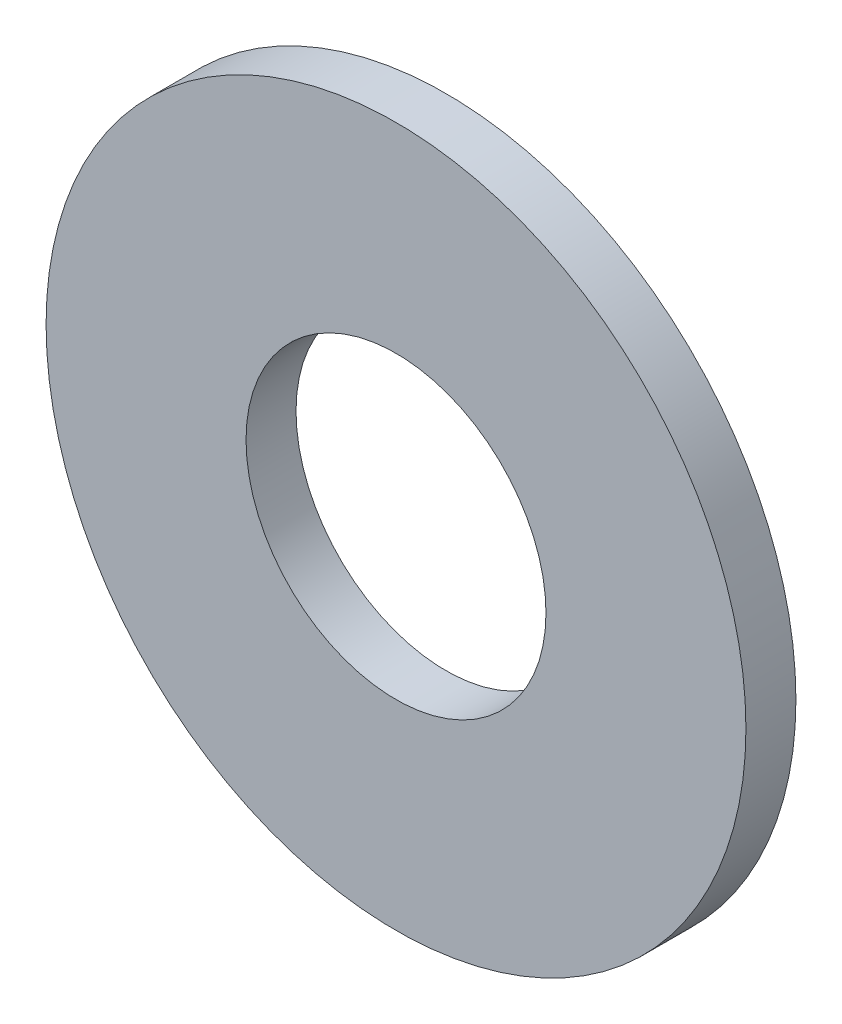
ISO-10303-21;
HEADER;
FILE_DESCRIPTION(('STEP AP214'),'2;1');
FILE_NAME('part.step','',(''),(''),'','','');
FILE_SCHEMA(('AUTOMOTIVE_DESIGN { 1 0 10303 214 1 1 1 1 }'));
ENDSEC;
DATA;
#1=APPLICATION_CONTEXT('core data for automotive mechanical design processes');
#2=APPLICATION_PROTOCOL_DEFINITION('international standard','automotive_design',2000,#1);
#3=PRODUCT_CONTEXT('',#1,'mechanical');
#4=PRODUCT('Part','Part','',(#3));
#5=PRODUCT_RELATED_PRODUCT_CATEGORY('part','',(#4));
#6=PRODUCT_DEFINITION_FORMATION('','',#4);
#7=PRODUCT_DEFINITION_CONTEXT('part definition',#1,'design');
#8=PRODUCT_DEFINITION('design','',#6,#7);
#9=PRODUCT_DEFINITION_SHAPE('','',#8);
#10=(LENGTH_UNIT() NAMED_UNIT(*) SI_UNIT(.MILLI.,.METRE.));
#11=(NAMED_UNIT(*) PLANE_ANGLE_UNIT() SI_UNIT($,.RADIAN.));
#12=(NAMED_UNIT(*) SI_UNIT($,.STERADIAN.) SOLID_ANGLE_UNIT());
#13=UNCERTAINTY_MEASURE_WITH_UNIT(LENGTH_MEASURE(1.E-05),#10,'distance_accuracy_value','');
#14=(GEOMETRIC_REPRESENTATION_CONTEXT(3) GLOBAL_UNCERTAINTY_ASSIGNED_CONTEXT((#13)) GLOBAL_UNIT_ASSIGNED_CONTEXT((#10,
#11,#12)) REPRESENTATION_CONTEXT('',''));
#15=CARTESIAN_POINT('',(0.,0.,0.));
#16=DIRECTION('',(0.,0.,1.));
#17=DIRECTION('',(1.,0.,0.));
#18=AXIS2_PLACEMENT_3D('',#15,#16,#17);
#19=CARTESIAN_POINT('',(0.,0.,1.));
#20=DIRECTION('',(0.,0.,1.));
#21=DIRECTION('',(1.,0.,0.));
#22=AXIS2_PLACEMENT_3D('',#19,#20,#21);
#23=PLANE('',#22);
#24=CARTESIAN_POINT('',(0.,0.,1.));
#25=DIRECTION('',(0.,0.,1.));
#26=DIRECTION('',(1.,0.,0.));
#27=AXIS2_PLACEMENT_3D('',#24,#25,#26);
#28=CIRCLE('',#27,7.);
#29=CARTESIAN_POINT('',(7.,0.,1.));
#30=VERTEX_POINT('',#29);
#31=EDGE_CURVE('E10',#30,#30,#28,.T.);
#32=ORIENTED_EDGE('',*,*,#31,.T.);
#33=EDGE_LOOP('',(#32));
#34=FACE_BOUND('',#33,.T.);
#35=CARTESIAN_POINT('',(0.,0.,1.));
#36=DIRECTION('',(0.,0.,1.));
#37=DIRECTION('',(1.,0.,0.));
#38=AXIS2_PLACEMENT_3D('',#35,#36,#37);
#39=CIRCLE('',#38,3.);
#40=CARTESIAN_POINT('',(3.,0.,1.));
#41=VERTEX_POINT('',#40);
#42=EDGE_CURVE('E42',#41,#41,#39,.T.);
#43=ORIENTED_EDGE('',*,*,#42,.F.);
#44=EDGE_LOOP('',(#43));
#45=FACE_BOUND('',#44,.T.);
#46=ADVANCED_FACE('F31',(#34,#45),#23,.T.);
#47=CARTESIAN_POINT('',(0.,0.,0.));
#48=DIRECTION('',(0.,0.,1.));
#49=DIRECTION('',(1.,0.,0.));
#50=AXIS2_PLACEMENT_3D('',#47,#48,#49);
#51=PLANE('',#50);
#52=CARTESIAN_POINT('',(0.,0.,0.));
#53=DIRECTION('',(0.,0.,1.));
#54=DIRECTION('',(1.,0.,0.));
#55=AXIS2_PLACEMENT_3D('',#52,#53,#54);
#56=CIRCLE('',#55,7.);
#57=CARTESIAN_POINT('',(7.,0.,0.));
#58=VERTEX_POINT('',#57);
#59=EDGE_CURVE('E35',#58,#58,#56,.T.);
#60=ORIENTED_EDGE('',*,*,#59,.F.);
#61=EDGE_LOOP('',(#60));
#62=FACE_BOUND('',#61,.T.);
#63=CARTESIAN_POINT('',(0.,0.,0.));
#64=DIRECTION('',(0.,0.,1.));
#65=DIRECTION('',(1.,0.,0.));
#66=AXIS2_PLACEMENT_3D('',#63,#64,#65);
#67=CIRCLE('',#66,3.);
#68=CARTESIAN_POINT('',(3.,0.,0.));
#69=VERTEX_POINT('',#68);
#70=EDGE_CURVE('E44',#69,#69,#67,.T.);
#71=ORIENTED_EDGE('',*,*,#70,.T.);
#72=EDGE_LOOP('',(#71));
#73=FACE_BOUND('',#72,.T.);
#74=ADVANCED_FACE('F54',(#62,#73),#51,.F.);
#75=CARTESIAN_POINT('',(0.,0.,1.));
#76=DIRECTION('',(0.,0.,-1.));
#77=DIRECTION('',(-1.,0.,0.));
#78=AXIS2_PLACEMENT_3D('',#75,#76,#77);
#79=CYLINDRICAL_SURFACE('',#78,7.);
#80=ORIENTED_EDGE('',*,*,#31,.F.);
#81=EDGE_LOOP('',(#80));
#82=FACE_BOUND('',#81,.T.);
#83=ORIENTED_EDGE('',*,*,#59,.T.);
#84=EDGE_LOOP('',(#83));
#85=FACE_BOUND('',#84,.T.);
#86=ADVANCED_FACE('F33',(#82,#85),#79,.T.);
#87=CARTESIAN_POINT('',(0.,0.,1.));
#88=DIRECTION('',(0.,0.,-1.));
#89=DIRECTION('',(-1.,0.,0.));
#90=AXIS2_PLACEMENT_3D('',#87,#88,#89);
#91=CYLINDRICAL_SURFACE('',#90,3.);
#92=ORIENTED_EDGE('',*,*,#42,.T.);
#93=EDGE_LOOP('',(#92));
#94=FACE_BOUND('',#93,.T.);
#95=ORIENTED_EDGE('',*,*,#70,.F.);
#96=EDGE_LOOP('',(#95));
#97=FACE_BOUND('',#96,.T.);
#98=ADVANCED_FACE('F50',(#94,#97),#91,.F.);
#99=CLOSED_SHELL('',(#46,#74,#86,#98));
#100=MANIFOLD_SOLID_BREP('B2',#99);
#101=ADVANCED_BREP_SHAPE_REPRESENTATION('',(#18,#100),#14);
#102=SHAPE_DEFINITION_REPRESENTATION(#9,#101);
ENDSEC;
END-ISO-10303-21;
